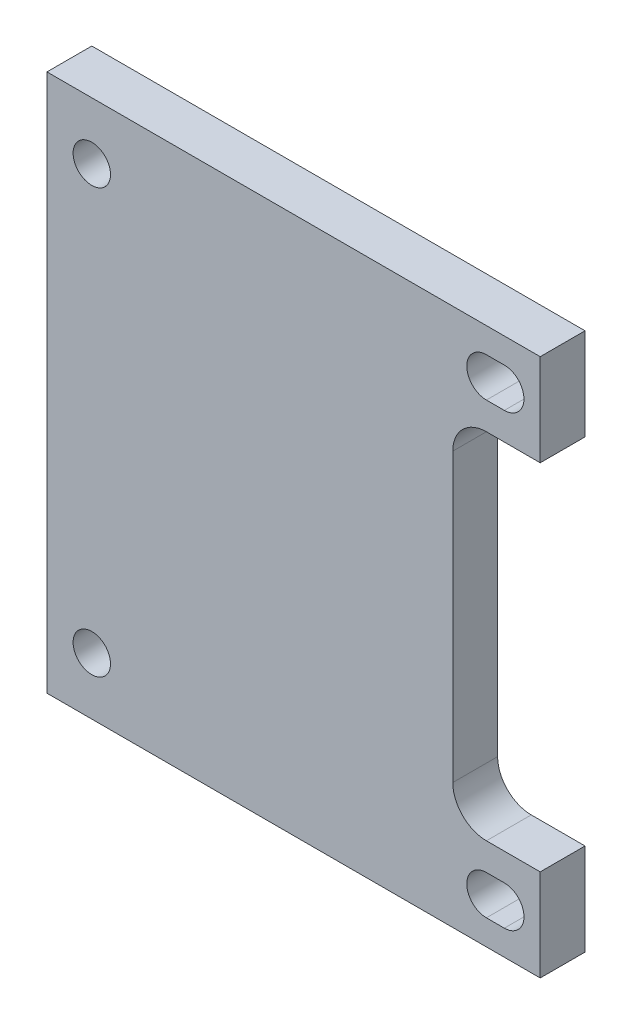
ISO-10303-21;
HEADER;
FILE_DESCRIPTION(('STEP AP214'),'2;1');
FILE_NAME('part.step','',(''),(''),'','','');
FILE_SCHEMA(('AUTOMOTIVE_DESIGN { 1 0 10303 214 1 1 1 1 }'));
ENDSEC;
DATA;
#1=APPLICATION_CONTEXT('core data for automotive mechanical design processes');
#2=APPLICATION_PROTOCOL_DEFINITION('international standard','automotive_design',2000,#1);
#3=PRODUCT_CONTEXT('',#1,'mechanical');
#4=PRODUCT('Part','Part','',(#3));
#5=PRODUCT_RELATED_PRODUCT_CATEGORY('part','',(#4));
#6=PRODUCT_DEFINITION_FORMATION('','',#4);
#7=PRODUCT_DEFINITION_CONTEXT('part definition',#1,'design');
#8=PRODUCT_DEFINITION('design','',#6,#7);
#9=PRODUCT_DEFINITION_SHAPE('','',#8);
#10=(LENGTH_UNIT() NAMED_UNIT(*) SI_UNIT(.MILLI.,.METRE.));
#11=(NAMED_UNIT(*) PLANE_ANGLE_UNIT() SI_UNIT($,.RADIAN.));
#12=(NAMED_UNIT(*) SI_UNIT($,.STERADIAN.) SOLID_ANGLE_UNIT());
#13=UNCERTAINTY_MEASURE_WITH_UNIT(LENGTH_MEASURE(1.E-05),#10,'distance_accuracy_value','');
#14=(GEOMETRIC_REPRESENTATION_CONTEXT(3) GLOBAL_UNCERTAINTY_ASSIGNED_CONTEXT((#13)) GLOBAL_UNIT_ASSIGNED_CONTEXT((#10,
#11,#12)) REPRESENTATION_CONTEXT('',''));
#15=CARTESIAN_POINT('',(0.,0.,0.));
#16=DIRECTION('',(0.,0.,1.));
#17=DIRECTION('',(1.,0.,0.));
#18=AXIS2_PLACEMENT_3D('',#15,#16,#17);
#19=CARTESIAN_POINT('',(69.85,0.,6.35));
#20=DIRECTION('',(-1.,0.,0.));
#21=DIRECTION('',(0.,0.,1.));
#22=AXIS2_PLACEMENT_3D('',#19,#20,#21);
#23=PLANE('',#22);
#24=DIRECTION('',(0.,0.,1.));
#25=VECTOR('',#24,1.);
#26=CARTESIAN_POINT('',(69.85,63.1825,0.));
#27=LINE('',#26,#25);
#28=CARTESIAN_POINT('',(69.85,63.1825,0.));
#29=VERTEX_POINT('',#28);
#30=CARTESIAN_POINT('',(69.85,63.1825,6.35));
#31=VERTEX_POINT('',#30);
#32=EDGE_CURVE('E198',#29,#31,#27,.T.);
#33=ORIENTED_EDGE('',*,*,#32,.F.);
#34=DIRECTION('',(0.,1.,0.));
#35=VECTOR('',#34,1.);
#36=CARTESIAN_POINT('',(69.85,0.,0.));
#37=LINE('',#36,#35);
#38=CARTESIAN_POINT('',(69.85,76.2,0.));
#39=VERTEX_POINT('',#38);
#40=EDGE_CURVE('E178',#29,#39,#37,.T.);
#41=ORIENTED_EDGE('',*,*,#40,.T.);
#42=DIRECTION('',(0.,0.,-1.));
#43=VECTOR('',#42,1.);
#44=CARTESIAN_POINT('',(69.85,76.2,6.35));
#45=LINE('',#44,#43);
#46=CARTESIAN_POINT('',(69.85,76.2,6.35));
#47=VERTEX_POINT('',#46);
#48=EDGE_CURVE('E306',#47,#39,#45,.T.);
#49=ORIENTED_EDGE('',*,*,#48,.F.);
#50=DIRECTION('',(0.,1.,0.));
#51=VECTOR('',#50,1.);
#52=CARTESIAN_POINT('',(69.85,0.,6.35));
#53=LINE('',#52,#51);
#54=EDGE_CURVE('E289',#31,#47,#53,.T.);
#55=ORIENTED_EDGE('',*,*,#54,.F.);
#56=EDGE_LOOP('',(#33,#41,#49,#55));
#57=FACE_BOUND('',#56,.T.);
#58=ADVANCED_FACE('F33',(#57),#23,.F.);
#59=CARTESIAN_POINT('',(0.,0.,6.35));
#60=DIRECTION('',(0.,0.,-1.));
#61=DIRECTION('',(-1.,0.,0.));
#62=AXIS2_PLACEMENT_3D('',#59,#60,#61);
#63=PLANE('',#62);
#64=CARTESIAN_POINT('',(6.35000000000001,8.10000000000001,6.35));
#65=DIRECTION('',(0.,0.,1.));
#66=DIRECTION('',(1.,0.,0.));
#67=AXIS2_PLACEMENT_3D('',#64,#65,#66);
#68=CIRCLE('',#67,2.65);
#69=CARTESIAN_POINT('',(9.00000000000001,8.10000000000001,6.35));
#70=VERTEX_POINT('',#69);
#71=EDGE_CURVE('E276',#70,#70,#68,.T.);
#72=ORIENTED_EDGE('',*,*,#71,.F.);
#73=EDGE_LOOP('',(#72));
#74=FACE_BOUND('',#73,.T.);
#75=CARTESIAN_POINT('',(6.35000000000001,68.1,6.35));
#76=DIRECTION('',(0.,0.,1.));
#77=DIRECTION('',(1.,0.,0.));
#78=AXIS2_PLACEMENT_3D('',#75,#76,#77);
#79=CIRCLE('',#78,2.65);
#80=CARTESIAN_POINT('',(9.00000000000001,68.1,6.35));
#81=VERTEX_POINT('',#80);
#82=EDGE_CURVE('E264',#81,#81,#79,.T.);
#83=ORIENTED_EDGE('',*,*,#82,.F.);
#84=EDGE_LOOP('',(#83));
#85=FACE_BOUND('',#84,.T.);
#86=DIRECTION('',(-1.,0.,0.));
#87=VECTOR('',#86,1.);
#88=CARTESIAN_POINT('',(64.77,72.6281249999999,6.35));
#89=LINE('',#88,#87);
#90=CARTESIAN_POINT('',(64.77,72.6281249999999,6.35));
#91=VERTEX_POINT('',#90);
#92=CARTESIAN_POINT('',(62.23,72.6281249999999,6.35));
#93=VERTEX_POINT('',#92);
#94=EDGE_CURVE('E254',#91,#93,#89,.T.);
#95=ORIENTED_EDGE('',*,*,#94,.F.);
#96=CARTESIAN_POINT('',(64.77,69.85,6.35));
#97=DIRECTION('',(0.,0.,1.));
#98=DIRECTION('',(1.,0.,0.));
#99=AXIS2_PLACEMENT_3D('',#96,#97,#98);
#100=CIRCLE('',#99,2.77812499999997);
#101=CARTESIAN_POINT('',(64.77,67.071875,6.35));
#102=VERTEX_POINT('',#101);
#103=EDGE_CURVE('E233',#102,#91,#100,.T.);
#104=ORIENTED_EDGE('',*,*,#103,.F.);
#105=DIRECTION('',(1.,0.,0.));
#106=VECTOR('',#105,1.);
#107=CARTESIAN_POINT('',(64.77,67.071875,6.35));
#108=LINE('',#107,#106);
#109=CARTESIAN_POINT('',(62.23,67.071875,6.35));
#110=VERTEX_POINT('',#109);
#111=EDGE_CURVE('E243',#110,#102,#108,.T.);
#112=ORIENTED_EDGE('',*,*,#111,.F.);
#113=CARTESIAN_POINT('',(62.23,69.85,6.35));
#114=DIRECTION('',(0.,0.,1.));
#115=DIRECTION('',(1.,0.,0.));
#116=AXIS2_PLACEMENT_3D('',#113,#114,#115);
#117=CIRCLE('',#116,2.77812499999997);
#118=EDGE_CURVE('E257',#93,#110,#117,.T.);
#119=ORIENTED_EDGE('',*,*,#118,.F.);
#120=EDGE_LOOP('',(#95,#104,#112,#119));
#121=FACE_BOUND('',#120,.T.);
#122=DIRECTION('',(-1.,0.,0.));
#123=VECTOR('',#122,1.);
#124=CARTESIAN_POINT('',(64.77,9.12812499999997,6.35));
#125=LINE('',#124,#123);
#126=CARTESIAN_POINT('',(64.77,9.12812499999997,6.35));
#127=VERTEX_POINT('',#126);
#128=CARTESIAN_POINT('',(62.23,9.12812499999997,6.35));
#129=VERTEX_POINT('',#128);
#130=EDGE_CURVE('E223',#127,#129,#125,.T.);
#131=ORIENTED_EDGE('',*,*,#130,.F.);
#132=CARTESIAN_POINT('',(64.77,6.35,6.35));
#133=DIRECTION('',(0.,0.,1.));
#134=DIRECTION('',(-1.,0.,0.));
#135=AXIS2_PLACEMENT_3D('',#132,#133,#134);
#136=CIRCLE('',#135,2.77812499999997);
#137=CARTESIAN_POINT('',(64.77,3.57187500000003,6.35));
#138=VERTEX_POINT('',#137);
#139=EDGE_CURVE('E56',#138,#127,#136,.T.);
#140=ORIENTED_EDGE('',*,*,#139,.F.);
#141=DIRECTION('',(1.,0.,0.));
#142=VECTOR('',#141,1.);
#143=CARTESIAN_POINT('',(64.77,3.57187500000003,6.35));
#144=LINE('',#143,#142);
#145=CARTESIAN_POINT('',(62.23,3.57187500000004,6.35));
#146=VERTEX_POINT('',#145);
#147=EDGE_CURVE('E212',#146,#138,#144,.T.);
#148=ORIENTED_EDGE('',*,*,#147,.F.);
#149=CARTESIAN_POINT('',(62.23,6.35000000000001,6.35));
#150=DIRECTION('',(0.,0.,1.));
#151=DIRECTION('',(-1.,0.,0.));
#152=AXIS2_PLACEMENT_3D('',#149,#150,#151);
#153=CIRCLE('',#152,2.77812499999997);
#154=EDGE_CURVE('E226',#129,#146,#153,.T.);
#155=ORIENTED_EDGE('',*,*,#154,.F.);
#156=EDGE_LOOP('',(#131,#140,#148,#155));
#157=FACE_BOUND('',#156,.T.);
#158=DIRECTION('',(1.,0.,0.));
#159=VECTOR('',#158,1.);
#160=CARTESIAN_POINT('',(1.15069990573128E-13,63.1825000000001,6.35));
#161=LINE('',#160,#159);
#162=CARTESIAN_POINT('',(62.23,63.1825,6.35));
#163=VERTEX_POINT('',#162);
#164=EDGE_CURVE('E164',#163,#31,#161,.T.);
#165=ORIENTED_EDGE('',*,*,#164,.T.);
#166=ORIENTED_EDGE('',*,*,#54,.T.);
#167=DIRECTION('',(-1.,0.,0.));
#168=VECTOR('',#167,1.);
#169=CARTESIAN_POINT('',(0.,76.2,6.35));
#170=LINE('',#169,#168);
#171=CARTESIAN_POINT('',(0.,76.2,6.35));
#172=VERTEX_POINT('',#171);
#173=EDGE_CURVE('E293',#47,#172,#170,.T.);
#174=ORIENTED_EDGE('',*,*,#173,.T.);
#175=DIRECTION('',(0.,-1.,0.));
#176=VECTOR('',#175,1.);
#177=CARTESIAN_POINT('',(0.,0.,6.35));
#178=LINE('',#177,#176);
#179=CARTESIAN_POINT('',(0.,0.,6.35));
#180=VERTEX_POINT('',#179);
#181=EDGE_CURVE('E283',#172,#180,#178,.T.);
#182=ORIENTED_EDGE('',*,*,#181,.T.);
#183=DIRECTION('',(1.,0.,0.));
#184=VECTOR('',#183,1.);
#185=CARTESIAN_POINT('',(0.,0.,6.35));
#186=LINE('',#185,#184);
#187=CARTESIAN_POINT('',(69.85,0.,6.35));
#188=VERTEX_POINT('',#187);
#189=EDGE_CURVE('E286',#180,#188,#186,.T.);
#190=ORIENTED_EDGE('',*,*,#189,.T.);
#191=CARTESIAN_POINT('',(69.85,13.0175,6.35));
#192=VERTEX_POINT('',#191);
#193=EDGE_CURVE('E290',#188,#192,#53,.T.);
#194=ORIENTED_EDGE('',*,*,#193,.T.);
#195=DIRECTION('',(1.,0.,0.));
#196=VECTOR('',#195,1.);
#197=CARTESIAN_POINT('',(0.,13.0175,6.35));
#198=LINE('',#197,#196);
#199=CARTESIAN_POINT('',(62.23,13.0175,6.35));
#200=VERTEX_POINT('',#199);
#201=EDGE_CURVE('E179',#200,#192,#198,.T.);
#202=ORIENTED_EDGE('',*,*,#201,.F.);
#203=CARTESIAN_POINT('',(62.23,17.78,6.35));
#204=DIRECTION('',(0.,0.,1.));
#205=DIRECTION('',(1.,0.,0.));
#206=AXIS2_PLACEMENT_3D('',#203,#204,#205);
#207=CIRCLE('',#206,4.7625);
#208=CARTESIAN_POINT('',(57.4675,17.78,6.35));
#209=VERTEX_POINT('',#208);
#210=EDGE_CURVE('E181',#209,#200,#207,.T.);
#211=ORIENTED_EDGE('',*,*,#210,.F.);
#212=DIRECTION('',(0.,1.,0.));
#213=VECTOR('',#212,1.);
#214=CARTESIAN_POINT('',(57.4675,0.,6.35));
#215=LINE('',#214,#213);
#216=CARTESIAN_POINT('',(57.4675,58.42,6.35));
#217=VERTEX_POINT('',#216);
#218=EDGE_CURVE('E193',#209,#217,#215,.T.);
#219=ORIENTED_EDGE('',*,*,#218,.T.);
#220=CARTESIAN_POINT('',(62.23,58.42,6.35));
#221=DIRECTION('',(0.,0.,1.));
#222=DIRECTION('',(1.,0.,0.));
#223=AXIS2_PLACEMENT_3D('',#220,#221,#222);
#224=CIRCLE('',#223,4.76250000000001);
#225=EDGE_CURVE('E191',#163,#217,#224,.T.);
#226=ORIENTED_EDGE('',*,*,#225,.F.);
#227=EDGE_LOOP('',(#165,#166,#174,#182,#190,#194,#202,#211,#219,#226));
#228=FACE_BOUND('',#227,.T.);
#229=ADVANCED_FACE('F322',(#74,#85,#121,#157,#228),#63,.F.);
#230=CARTESIAN_POINT('',(0.,0.,0.));
#231=DIRECTION('',(0.,0.,-1.));
#232=DIRECTION('',(-1.,0.,0.));
#233=AXIS2_PLACEMENT_3D('',#230,#231,#232);
#234=PLANE('',#233);
#235=CARTESIAN_POINT('',(6.35000000000001,8.10000000000001,0.));
#236=DIRECTION('',(0.,0.,1.));
#237=DIRECTION('',(1.,0.,0.));
#238=AXIS2_PLACEMENT_3D('',#235,#236,#237);
#239=CIRCLE('',#238,2.65);
#240=CARTESIAN_POINT('',(9.00000000000001,8.10000000000001,0.));
#241=VERTEX_POINT('',#240);
#242=EDGE_CURVE('E279',#241,#241,#239,.T.);
#243=ORIENTED_EDGE('',*,*,#242,.T.);
#244=EDGE_LOOP('',(#243));
#245=FACE_BOUND('',#244,.T.);
#246=CARTESIAN_POINT('',(6.35000000000001,68.1,0.));
#247=DIRECTION('',(0.,0.,1.));
#248=DIRECTION('',(1.,0.,0.));
#249=AXIS2_PLACEMENT_3D('',#246,#247,#248);
#250=CIRCLE('',#249,2.65);
#251=CARTESIAN_POINT('',(9.00000000000001,68.1,0.));
#252=VERTEX_POINT('',#251);
#253=EDGE_CURVE('E273',#252,#252,#250,.T.);
#254=ORIENTED_EDGE('',*,*,#253,.T.);
#255=EDGE_LOOP('',(#254));
#256=FACE_BOUND('',#255,.T.);
#257=CARTESIAN_POINT('',(64.77,69.85,0.));
#258=DIRECTION('',(0.,0.,1.));
#259=DIRECTION('',(1.,0.,0.));
#260=AXIS2_PLACEMENT_3D('',#257,#258,#259);
#261=CIRCLE('',#260,2.77812499999997);
#262=CARTESIAN_POINT('',(64.77,67.071875,0.));
#263=VERTEX_POINT('',#262);
#264=CARTESIAN_POINT('',(64.77,72.6281249999999,0.));
#265=VERTEX_POINT('',#264);
#266=EDGE_CURVE('E239',#263,#265,#261,.T.);
#267=ORIENTED_EDGE('',*,*,#266,.T.);
#268=DIRECTION('',(-1.,0.,0.));
#269=VECTOR('',#268,1.);
#270=CARTESIAN_POINT('',(64.77,72.6281249999999,0.));
#271=LINE('',#270,#269);
#272=CARTESIAN_POINT('',(62.23,72.6281249999999,0.));
#273=VERTEX_POINT('',#272);
#274=EDGE_CURVE('E242',#265,#273,#271,.T.);
#275=ORIENTED_EDGE('',*,*,#274,.T.);
#276=CARTESIAN_POINT('',(62.23,69.85,0.));
#277=DIRECTION('',(0.,0.,1.));
#278=DIRECTION('',(1.,0.,0.));
#279=AXIS2_PLACEMENT_3D('',#276,#277,#278);
#280=CIRCLE('',#279,2.77812499999997);
#281=CARTESIAN_POINT('',(62.23,67.071875,0.));
#282=VERTEX_POINT('',#281);
#283=EDGE_CURVE('E246',#273,#282,#280,.T.);
#284=ORIENTED_EDGE('',*,*,#283,.T.);
#285=DIRECTION('',(1.,0.,0.));
#286=VECTOR('',#285,1.);
#287=CARTESIAN_POINT('',(64.77,67.071875,0.));
#288=LINE('',#287,#286);
#289=EDGE_CURVE('E249',#282,#263,#288,.T.);
#290=ORIENTED_EDGE('',*,*,#289,.T.);
#291=EDGE_LOOP('',(#267,#275,#284,#290));
#292=FACE_BOUND('',#291,.T.);
#293=CARTESIAN_POINT('',(64.77,6.35,0.));
#294=DIRECTION('',(0.,0.,1.));
#295=DIRECTION('',(-1.,0.,0.));
#296=AXIS2_PLACEMENT_3D('',#293,#294,#295);
#297=CIRCLE('',#296,2.77812499999997);
#298=CARTESIAN_POINT('',(64.77,3.57187500000003,0.));
#299=VERTEX_POINT('',#298);
#300=CARTESIAN_POINT('',(64.77,9.12812499999997,0.));
#301=VERTEX_POINT('',#300);
#302=EDGE_CURVE('E208',#299,#301,#297,.T.);
#303=ORIENTED_EDGE('',*,*,#302,.T.);
#304=DIRECTION('',(-1.,0.,0.));
#305=VECTOR('',#304,1.);
#306=CARTESIAN_POINT('',(64.77,9.12812499999997,0.));
#307=LINE('',#306,#305);
#308=CARTESIAN_POINT('',(62.23,9.12812499999997,0.));
#309=VERTEX_POINT('',#308);
#310=EDGE_CURVE('E211',#301,#309,#307,.T.);
#311=ORIENTED_EDGE('',*,*,#310,.T.);
#312=CARTESIAN_POINT('',(62.23,6.35000000000001,0.));
#313=DIRECTION('',(0.,0.,1.));
#314=DIRECTION('',(-1.,0.,0.));
#315=AXIS2_PLACEMENT_3D('',#312,#313,#314);
#316=CIRCLE('',#315,2.77812499999997);
#317=CARTESIAN_POINT('',(62.23,3.57187500000004,0.));
#318=VERTEX_POINT('',#317);
#319=EDGE_CURVE('E215',#309,#318,#316,.T.);
#320=ORIENTED_EDGE('',*,*,#319,.T.);
#321=DIRECTION('',(1.,0.,0.));
#322=VECTOR('',#321,1.);
#323=CARTESIAN_POINT('',(64.77,3.57187500000003,0.));
#324=LINE('',#323,#322);
#325=EDGE_CURVE('E218',#318,#299,#324,.T.);
#326=ORIENTED_EDGE('',*,*,#325,.T.);
#327=EDGE_LOOP('',(#303,#311,#320,#326));
#328=FACE_BOUND('',#327,.T.);
#329=ORIENTED_EDGE('',*,*,#40,.F.);
#330=DIRECTION('',(1.,0.,0.));
#331=VECTOR('',#330,1.);
#332=CARTESIAN_POINT('',(1.15069990573128E-13,63.1825000000001,0.));
#333=LINE('',#332,#331);
#334=CARTESIAN_POINT('',(62.23,63.1825,0.));
#335=VERTEX_POINT('',#334);
#336=EDGE_CURVE('E161',#335,#29,#333,.T.);
#337=ORIENTED_EDGE('',*,*,#336,.F.);
#338=CARTESIAN_POINT('',(62.23,58.42,0.));
#339=DIRECTION('',(0.,0.,1.));
#340=DIRECTION('',(1.,0.,0.));
#341=AXIS2_PLACEMENT_3D('',#338,#339,#340);
#342=CIRCLE('',#341,4.76250000000001);
#343=CARTESIAN_POINT('',(57.4675,58.42,0.));
#344=VERTEX_POINT('',#343);
#345=EDGE_CURVE('E169',#335,#344,#342,.T.);
#346=ORIENTED_EDGE('',*,*,#345,.T.);
#347=DIRECTION('',(0.,1.,0.));
#348=VECTOR('',#347,1.);
#349=CARTESIAN_POINT('',(57.4675,0.,0.));
#350=LINE('',#349,#348);
#351=CARTESIAN_POINT('',(57.4675,17.78,0.));
#352=VERTEX_POINT('',#351);
#353=EDGE_CURVE('E173',#352,#344,#350,.T.);
#354=ORIENTED_EDGE('',*,*,#353,.F.);
#355=CARTESIAN_POINT('',(62.23,17.78,0.));
#356=DIRECTION('',(0.,0.,1.));
#357=DIRECTION('',(1.,0.,0.));
#358=AXIS2_PLACEMENT_3D('',#355,#356,#357);
#359=CIRCLE('',#358,4.7625);
#360=CARTESIAN_POINT('',(62.23,13.0175,0.));
#361=VERTEX_POINT('',#360);
#362=EDGE_CURVE('E185',#352,#361,#359,.T.);
#363=ORIENTED_EDGE('',*,*,#362,.T.);
#364=DIRECTION('',(1.,0.,0.));
#365=VECTOR('',#364,1.);
#366=CARTESIAN_POINT('',(0.,13.0175,0.));
#367=LINE('',#366,#365);
#368=CARTESIAN_POINT('',(69.85,13.0175,0.));
#369=VERTEX_POINT('',#368);
#370=EDGE_CURVE('E166',#361,#369,#367,.T.);
#371=ORIENTED_EDGE('',*,*,#370,.T.);
#372=CARTESIAN_POINT('',(69.85,0.,0.));
#373=VERTEX_POINT('',#372);
#374=EDGE_CURVE('E300',#373,#369,#37,.T.);
#375=ORIENTED_EDGE('',*,*,#374,.F.);
#376=DIRECTION('',(1.,0.,0.));
#377=VECTOR('',#376,1.);
#378=CARTESIAN_POINT('',(0.,0.,0.));
#379=LINE('',#378,#377);
#380=CARTESIAN_POINT('',(0.,0.,0.));
#381=VERTEX_POINT('',#380);
#382=EDGE_CURVE('E298',#381,#373,#379,.T.);
#383=ORIENTED_EDGE('',*,*,#382,.F.);
#384=DIRECTION('',(0.,-1.,0.));
#385=VECTOR('',#384,1.);
#386=CARTESIAN_POINT('',(0.,0.,0.));
#387=LINE('',#386,#385);
#388=CARTESIAN_POINT('',(0.,76.2,0.));
#389=VERTEX_POINT('',#388);
#390=EDGE_CURVE('E282',#389,#381,#387,.T.);
#391=ORIENTED_EDGE('',*,*,#390,.F.);
#392=DIRECTION('',(-1.,0.,0.));
#393=VECTOR('',#392,1.);
#394=CARTESIAN_POINT('',(0.,76.2,0.));
#395=LINE('',#394,#393);
#396=EDGE_CURVE('E287',#39,#389,#395,.T.);
#397=ORIENTED_EDGE('',*,*,#396,.F.);
#398=EDGE_LOOP('',(#329,#337,#346,#354,#363,#371,#375,#383,#391,#397));
#399=FACE_BOUND('',#398,.T.);
#400=ADVANCED_FACE('F176',(#245,#256,#292,#328,#399),#234,.T.);
#401=CARTESIAN_POINT('',(0.,0.,6.35));
#402=DIRECTION('',(1.,0.,0.));
#403=DIRECTION('',(0.,0.,-1.));
#404=AXIS2_PLACEMENT_3D('',#401,#402,#403);
#405=PLANE('',#404);
#406=ORIENTED_EDGE('',*,*,#390,.T.);
#407=DIRECTION('',(0.,0.,-1.));
#408=VECTOR('',#407,1.);
#409=CARTESIAN_POINT('',(0.,0.,6.35));
#410=LINE('',#409,#408);
#411=EDGE_CURVE('E11',#180,#381,#410,.T.);
#412=ORIENTED_EDGE('',*,*,#411,.F.);
#413=ORIENTED_EDGE('',*,*,#181,.F.);
#414=DIRECTION('',(0.,0.,-1.));
#415=VECTOR('',#414,1.);
#416=CARTESIAN_POINT('',(0.,76.2,6.35));
#417=LINE('',#416,#415);
#418=EDGE_CURVE('E295',#172,#389,#417,.T.);
#419=ORIENTED_EDGE('',*,*,#418,.T.);
#420=EDGE_LOOP('',(#406,#412,#413,#419));
#421=FACE_BOUND('',#420,.T.);
#422=ADVANCED_FACE('F35',(#421),#405,.F.);
#423=CARTESIAN_POINT('',(0.,0.,6.35));
#424=DIRECTION('',(0.,1.,0.));
#425=DIRECTION('',(0.,0.,1.));
#426=AXIS2_PLACEMENT_3D('',#423,#424,#425);
#427=PLANE('',#426);
#428=ORIENTED_EDGE('',*,*,#382,.T.);
#429=DIRECTION('',(0.,0.,-1.));
#430=VECTOR('',#429,1.);
#431=CARTESIAN_POINT('',(69.85,0.,6.35));
#432=LINE('',#431,#430);
#433=EDGE_CURVE('E41',#188,#373,#432,.T.);
#434=ORIENTED_EDGE('',*,*,#433,.F.);
#435=ORIENTED_EDGE('',*,*,#189,.F.);
#436=ORIENTED_EDGE('',*,*,#411,.T.);
#437=EDGE_LOOP('',(#428,#434,#435,#436));
#438=FACE_BOUND('',#437,.T.);
#439=ADVANCED_FACE('F326',(#438),#427,.F.);
#440=ORIENTED_EDGE('',*,*,#374,.T.);
#441=DIRECTION('',(0.,0.,1.));
#442=VECTOR('',#441,1.);
#443=CARTESIAN_POINT('',(69.85,13.0175,0.));
#444=LINE('',#443,#442);
#445=EDGE_CURVE('E200',#369,#192,#444,.T.);
#446=ORIENTED_EDGE('',*,*,#445,.T.);
#447=ORIENTED_EDGE('',*,*,#193,.F.);
#448=ORIENTED_EDGE('',*,*,#433,.T.);
#449=EDGE_LOOP('',(#440,#446,#447,#448));
#450=FACE_BOUND('',#449,.T.);
#451=ADVANCED_FACE('F313',(#450),#23,.F.);
#452=CARTESIAN_POINT('',(0.,76.2,6.35));
#453=DIRECTION('',(0.,-1.,0.));
#454=DIRECTION('',(0.,0.,-1.));
#455=AXIS2_PLACEMENT_3D('',#452,#453,#454);
#456=PLANE('',#455);
#457=ORIENTED_EDGE('',*,*,#396,.T.);
#458=ORIENTED_EDGE('',*,*,#418,.F.);
#459=ORIENTED_EDGE('',*,*,#173,.F.);
#460=ORIENTED_EDGE('',*,*,#48,.T.);
#461=EDGE_LOOP('',(#457,#458,#459,#460));
#462=FACE_BOUND('',#461,.T.);
#463=ADVANCED_FACE('F330',(#462),#456,.F.);
#464=CARTESIAN_POINT('',(6.35000000000001,8.10000000000001,6.35));
#465=DIRECTION('',(0.,0.,1.));
#466=DIRECTION('',(1.,0.,0.));
#467=AXIS2_PLACEMENT_3D('',#464,#465,#466);
#468=CYLINDRICAL_SURFACE('',#467,2.65);
#469=ORIENTED_EDGE('',*,*,#242,.F.);
#470=EDGE_LOOP('',(#469));
#471=FACE_BOUND('',#470,.T.);
#472=ORIENTED_EDGE('',*,*,#71,.T.);
#473=EDGE_LOOP('',(#472));
#474=FACE_BOUND('',#473,.T.);
#475=ADVANCED_FACE('F361',(#471,#474),#468,.F.);
#476=CARTESIAN_POINT('',(6.35000000000001,68.1,6.35));
#477=DIRECTION('',(0.,0.,1.));
#478=DIRECTION('',(1.,0.,0.));
#479=AXIS2_PLACEMENT_3D('',#476,#477,#478);
#480=CYLINDRICAL_SURFACE('',#479,2.65);
#481=ORIENTED_EDGE('',*,*,#253,.F.);
#482=EDGE_LOOP('',(#481));
#483=FACE_BOUND('',#482,.T.);
#484=ORIENTED_EDGE('',*,*,#82,.T.);
#485=EDGE_LOOP('',(#484));
#486=FACE_BOUND('',#485,.T.);
#487=ADVANCED_FACE('F376',(#483,#486),#480,.F.);
#488=CARTESIAN_POINT('',(64.77,69.85,0.));
#489=DIRECTION('',(0.,0.,1.));
#490=DIRECTION('',(1.,0.,0.));
#491=AXIS2_PLACEMENT_3D('',#488,#489,#490);
#492=CYLINDRICAL_SURFACE('',#491,2.77812499999997);
#493=ORIENTED_EDGE('',*,*,#103,.T.);
#494=DIRECTION('',(0.,0.,1.));
#495=VECTOR('',#494,1.);
#496=CARTESIAN_POINT('',(64.77,72.6281249999999,0.));
#497=LINE('',#496,#495);
#498=EDGE_CURVE('E252',#265,#91,#497,.T.);
#499=ORIENTED_EDGE('',*,*,#498,.F.);
#500=ORIENTED_EDGE('',*,*,#266,.F.);
#501=DIRECTION('',(0.,0.,1.));
#502=VECTOR('',#501,1.);
#503=CARTESIAN_POINT('',(64.77,67.071875,0.));
#504=LINE('',#503,#502);
#505=EDGE_CURVE('E262',#263,#102,#504,.T.);
#506=ORIENTED_EDGE('',*,*,#505,.T.);
#507=EDGE_LOOP('',(#493,#499,#500,#506));
#508=FACE_BOUND('',#507,.T.);
#509=ADVANCED_FACE('F380',(#508),#492,.F.);
#510=CARTESIAN_POINT('',(64.77,67.071875,0.));
#511=DIRECTION('',(0.,-1.,0.));
#512=DIRECTION('',(0.,0.,-1.));
#513=AXIS2_PLACEMENT_3D('',#510,#511,#512);
#514=PLANE('',#513);
#515=ORIENTED_EDGE('',*,*,#111,.T.);
#516=ORIENTED_EDGE('',*,*,#505,.F.);
#517=ORIENTED_EDGE('',*,*,#289,.F.);
#518=DIRECTION('',(0.,0.,1.));
#519=VECTOR('',#518,1.);
#520=CARTESIAN_POINT('',(62.23,67.071875,0.));
#521=LINE('',#520,#519);
#522=EDGE_CURVE('E265',#282,#110,#521,.T.);
#523=ORIENTED_EDGE('',*,*,#522,.T.);
#524=EDGE_LOOP('',(#515,#516,#517,#523));
#525=FACE_BOUND('',#524,.T.);
#526=ADVANCED_FACE('F384',(#525),#514,.F.);
#527=CARTESIAN_POINT('',(62.23,69.85,0.));
#528=DIRECTION('',(0.,0.,1.));
#529=DIRECTION('',(1.,0.,0.));
#530=AXIS2_PLACEMENT_3D('',#527,#528,#529);
#531=CYLINDRICAL_SURFACE('',#530,2.77812499999997);
#532=ORIENTED_EDGE('',*,*,#118,.T.);
#533=ORIENTED_EDGE('',*,*,#522,.F.);
#534=ORIENTED_EDGE('',*,*,#283,.F.);
#535=DIRECTION('',(0.,0.,1.));
#536=VECTOR('',#535,1.);
#537=CARTESIAN_POINT('',(62.23,72.6281249999999,0.));
#538=LINE('',#537,#536);
#539=EDGE_CURVE('E267',#273,#93,#538,.T.);
#540=ORIENTED_EDGE('',*,*,#539,.T.);
#541=EDGE_LOOP('',(#532,#533,#534,#540));
#542=FACE_BOUND('',#541,.T.);
#543=ADVANCED_FACE('F390',(#542),#531,.F.);
#544=CARTESIAN_POINT('',(64.77,72.6281249999999,0.));
#545=DIRECTION('',(0.,1.,0.));
#546=DIRECTION('',(0.,0.,1.));
#547=AXIS2_PLACEMENT_3D('',#544,#545,#546);
#548=PLANE('',#547);
#549=ORIENTED_EDGE('',*,*,#94,.T.);
#550=ORIENTED_EDGE('',*,*,#539,.F.);
#551=ORIENTED_EDGE('',*,*,#274,.F.);
#552=ORIENTED_EDGE('',*,*,#498,.T.);
#553=EDGE_LOOP('',(#549,#550,#551,#552));
#554=FACE_BOUND('',#553,.T.);
#555=ADVANCED_FACE('F386',(#554),#548,.F.);
#556=CARTESIAN_POINT('',(64.77,6.35,0.));
#557=DIRECTION('',(0.,0.,1.));
#558=DIRECTION('',(1.,0.,0.));
#559=AXIS2_PLACEMENT_3D('',#556,#557,#558);
#560=CYLINDRICAL_SURFACE('',#559,2.77812499999997);
#561=ORIENTED_EDGE('',*,*,#139,.T.);
#562=DIRECTION('',(0.,0.,1.));
#563=VECTOR('',#562,1.);
#564=CARTESIAN_POINT('',(64.77,9.12812499999997,0.));
#565=LINE('',#564,#563);
#566=EDGE_CURVE('E221',#301,#127,#565,.T.);
#567=ORIENTED_EDGE('',*,*,#566,.F.);
#568=ORIENTED_EDGE('',*,*,#302,.F.);
#569=DIRECTION('',(0.,0.,1.));
#570=VECTOR('',#569,1.);
#571=CARTESIAN_POINT('',(64.77,3.57187500000003,0.));
#572=LINE('',#571,#570);
#573=EDGE_CURVE('E231',#299,#138,#572,.T.);
#574=ORIENTED_EDGE('',*,*,#573,.T.);
#575=EDGE_LOOP('',(#561,#567,#568,#574));
#576=FACE_BOUND('',#575,.T.);
#577=ADVANCED_FACE('F389',(#576),#560,.F.);
#578=CARTESIAN_POINT('',(64.77,3.57187500000003,0.));
#579=DIRECTION('',(0.,-1.,0.));
#580=DIRECTION('',(0.,0.,-1.));
#581=AXIS2_PLACEMENT_3D('',#578,#579,#580);
#582=PLANE('',#581);
#583=ORIENTED_EDGE('',*,*,#147,.T.);
#584=ORIENTED_EDGE('',*,*,#573,.F.);
#585=ORIENTED_EDGE('',*,*,#325,.F.);
#586=DIRECTION('',(0.,0.,1.));
#587=VECTOR('',#586,1.);
#588=CARTESIAN_POINT('',(62.23,3.57187500000004,0.));
#589=LINE('',#588,#587);
#590=EDGE_CURVE('E234',#318,#146,#589,.T.);
#591=ORIENTED_EDGE('',*,*,#590,.T.);
#592=EDGE_LOOP('',(#583,#584,#585,#591));
#593=FACE_BOUND('',#592,.T.);
#594=ADVANCED_FACE('F400',(#593),#582,.F.);
#595=CARTESIAN_POINT('',(62.23,6.35000000000001,0.));
#596=DIRECTION('',(0.,0.,1.));
#597=DIRECTION('',(1.,0.,0.));
#598=AXIS2_PLACEMENT_3D('',#595,#596,#597);
#599=CYLINDRICAL_SURFACE('',#598,2.77812499999997);
#600=ORIENTED_EDGE('',*,*,#154,.T.);
#601=ORIENTED_EDGE('',*,*,#590,.F.);
#602=ORIENTED_EDGE('',*,*,#319,.F.);
#603=DIRECTION('',(0.,0.,1.));
#604=VECTOR('',#603,1.);
#605=CARTESIAN_POINT('',(62.23,9.12812499999997,0.));
#606=LINE('',#605,#604);
#607=EDGE_CURVE('E236',#309,#129,#606,.T.);
#608=ORIENTED_EDGE('',*,*,#607,.T.);
#609=EDGE_LOOP('',(#600,#601,#602,#608));
#610=FACE_BOUND('',#609,.T.);
#611=ADVANCED_FACE('F404',(#610),#599,.F.);
#612=CARTESIAN_POINT('',(64.77,9.12812499999997,0.));
#613=DIRECTION('',(0.,1.,0.));
#614=DIRECTION('',(0.,0.,1.));
#615=AXIS2_PLACEMENT_3D('',#612,#613,#614);
#616=PLANE('',#615);
#617=ORIENTED_EDGE('',*,*,#130,.T.);
#618=ORIENTED_EDGE('',*,*,#607,.F.);
#619=ORIENTED_EDGE('',*,*,#310,.F.);
#620=ORIENTED_EDGE('',*,*,#566,.T.);
#621=EDGE_LOOP('',(#617,#618,#619,#620));
#622=FACE_BOUND('',#621,.T.);
#623=ADVANCED_FACE('F401',(#622),#616,.F.);
#624=CARTESIAN_POINT('',(1.15069990573128E-13,63.1825000000001,0.));
#625=DIRECTION('',(0.,-1.,0.));
#626=DIRECTION('',(1.,0.,0.));
#627=AXIS2_PLACEMENT_3D('',#624,#625,#626);
#628=PLANE('',#627);
#629=ORIENTED_EDGE('',*,*,#164,.F.);
#630=DIRECTION('',(0.,0.,1.));
#631=VECTOR('',#630,1.);
#632=CARTESIAN_POINT('',(62.23,63.1825,0.));
#633=LINE('',#632,#631);
#634=EDGE_CURVE('E158',#335,#163,#633,.T.);
#635=ORIENTED_EDGE('',*,*,#634,.F.);
#636=ORIENTED_EDGE('',*,*,#336,.T.);
#637=ORIENTED_EDGE('',*,*,#32,.T.);
#638=EDGE_LOOP('',(#629,#635,#636,#637));
#639=FACE_BOUND('',#638,.T.);
#640=ADVANCED_FACE('F159',(#639),#628,.T.);
#641=CARTESIAN_POINT('',(0.,13.0175,0.));
#642=DIRECTION('',(0.,-1.,0.));
#643=DIRECTION('',(1.,0.,0.));
#644=AXIS2_PLACEMENT_3D('',#641,#642,#643);
#645=PLANE('',#644);
#646=ORIENTED_EDGE('',*,*,#201,.T.);
#647=ORIENTED_EDGE('',*,*,#445,.F.);
#648=ORIENTED_EDGE('',*,*,#370,.F.);
#649=DIRECTION('',(0.,0.,1.));
#650=VECTOR('',#649,1.);
#651=CARTESIAN_POINT('',(62.23,13.0175,0.));
#652=LINE('',#651,#650);
#653=EDGE_CURVE('E203',#361,#200,#652,.T.);
#654=ORIENTED_EDGE('',*,*,#653,.T.);
#655=EDGE_LOOP('',(#646,#647,#648,#654));
#656=FACE_BOUND('',#655,.T.);
#657=ADVANCED_FACE('F319',(#656),#645,.F.);
#658=CARTESIAN_POINT('',(62.23,17.78,0.));
#659=DIRECTION('',(0.,0.,1.));
#660=DIRECTION('',(1.,0.,0.));
#661=AXIS2_PLACEMENT_3D('',#658,#659,#660);
#662=CYLINDRICAL_SURFACE('',#661,4.7625);
#663=ORIENTED_EDGE('',*,*,#210,.T.);
#664=ORIENTED_EDGE('',*,*,#653,.F.);
#665=ORIENTED_EDGE('',*,*,#362,.F.);
#666=DIRECTION('',(0.,0.,1.));
#667=VECTOR('',#666,1.);
#668=CARTESIAN_POINT('',(57.4675,17.78,0.));
#669=LINE('',#668,#667);
#670=EDGE_CURVE('E205',#352,#209,#669,.T.);
#671=ORIENTED_EDGE('',*,*,#670,.T.);
#672=EDGE_LOOP('',(#663,#664,#665,#671));
#673=FACE_BOUND('',#672,.T.);
#674=ADVANCED_FACE('F339',(#673),#662,.F.);
#675=CARTESIAN_POINT('',(57.4675,0.,0.));
#676=DIRECTION('',(1.,0.,0.));
#677=DIRECTION('',(0.,1.,0.));
#678=AXIS2_PLACEMENT_3D('',#675,#676,#677);
#679=PLANE('',#678);
#680=ORIENTED_EDGE('',*,*,#218,.F.);
#681=ORIENTED_EDGE('',*,*,#670,.F.);
#682=ORIENTED_EDGE('',*,*,#353,.T.);
#683=DIRECTION('',(0.,0.,1.));
#684=VECTOR('',#683,1.);
#685=CARTESIAN_POINT('',(57.4675,58.42,0.));
#686=LINE('',#685,#684);
#687=EDGE_CURVE('E48',#344,#217,#686,.T.);
#688=ORIENTED_EDGE('',*,*,#687,.T.);
#689=EDGE_LOOP('',(#680,#681,#682,#688));
#690=FACE_BOUND('',#689,.T.);
#691=ADVANCED_FACE('F337',(#690),#679,.T.);
#692=CARTESIAN_POINT('',(62.23,58.42,0.));
#693=DIRECTION('',(0.,0.,1.));
#694=DIRECTION('',(1.,0.,0.));
#695=AXIS2_PLACEMENT_3D('',#692,#693,#694);
#696=CYLINDRICAL_SURFACE('',#695,4.76250000000001);
#697=ORIENTED_EDGE('',*,*,#225,.T.);
#698=ORIENTED_EDGE('',*,*,#687,.F.);
#699=ORIENTED_EDGE('',*,*,#345,.F.);
#700=ORIENTED_EDGE('',*,*,#634,.T.);
#701=EDGE_LOOP('',(#697,#698,#699,#700));
#702=FACE_BOUND('',#701,.T.);
#703=ADVANCED_FACE('F170',(#702),#696,.F.);
#704=CLOSED_SHELL('',(#58,#229,#400,#422,#439,#451,#463,#475,#487,#509,#526,#543,#555,#577,#594,
#611,#623,#640,#657,#674,#691,#703));
#705=MANIFOLD_SOLID_BREP('B2',#704);
#706=ADVANCED_BREP_SHAPE_REPRESENTATION('',(#18,#705),#14);
#707=SHAPE_DEFINITION_REPRESENTATION(#9,#706);
ENDSEC;
END-ISO-10303-21;
